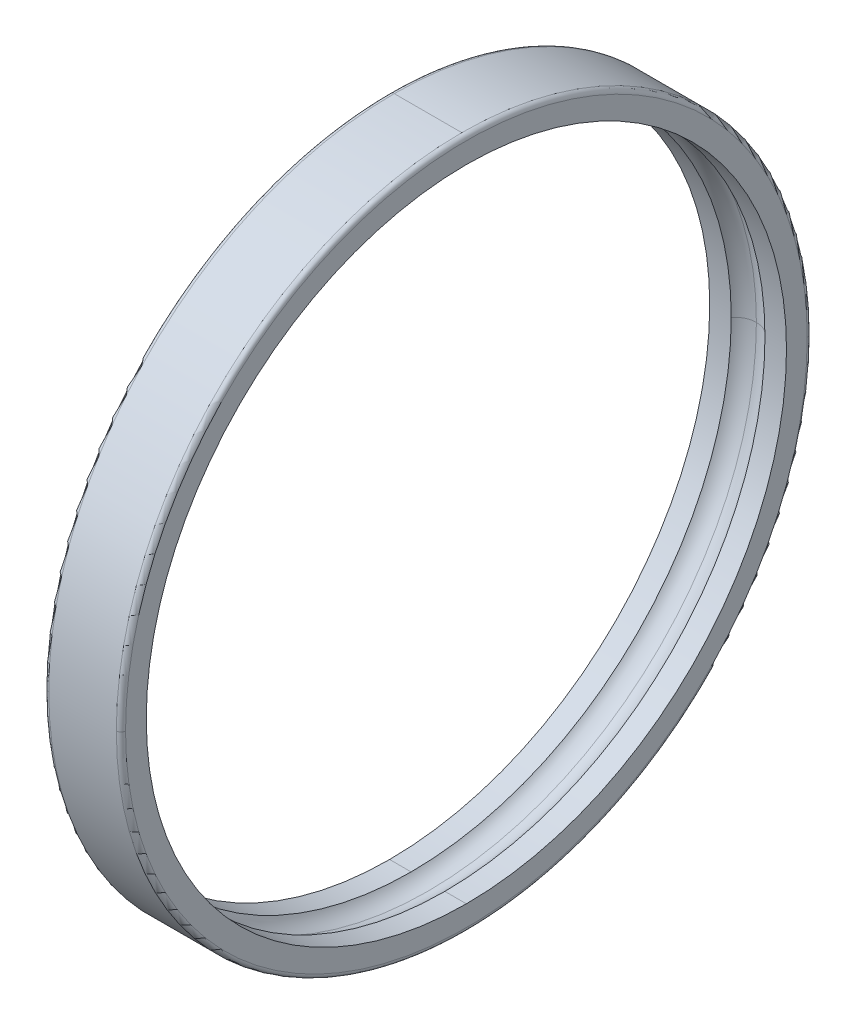
ISO-10303-21;
HEADER;
FILE_DESCRIPTION(('STEP AP214'),'2;1');
FILE_NAME('part.step','',(''),(''),'','','');
FILE_SCHEMA(('AUTOMOTIVE_DESIGN { 1 0 10303 214 1 1 1 1 }'));
ENDSEC;
DATA;
#1=APPLICATION_CONTEXT('core data for automotive mechanical design processes');
#2=APPLICATION_PROTOCOL_DEFINITION('international standard','automotive_design',2000,#1);
#3=PRODUCT_CONTEXT('',#1,'mechanical');
#4=PRODUCT('Part','Part','',(#3));
#5=PRODUCT_RELATED_PRODUCT_CATEGORY('part','',(#4));
#6=PRODUCT_DEFINITION_FORMATION('','',#4);
#7=PRODUCT_DEFINITION_CONTEXT('part definition',#1,'design');
#8=PRODUCT_DEFINITION('design','',#6,#7);
#9=PRODUCT_DEFINITION_SHAPE('','',#8);
#10=(LENGTH_UNIT() NAMED_UNIT(*) SI_UNIT(.MILLI.,.METRE.));
#11=(NAMED_UNIT(*) PLANE_ANGLE_UNIT() SI_UNIT($,.RADIAN.));
#12=(NAMED_UNIT(*) SI_UNIT($,.STERADIAN.) SOLID_ANGLE_UNIT());
#13=UNCERTAINTY_MEASURE_WITH_UNIT(LENGTH_MEASURE(1.E-05),#10,'distance_accuracy_value','');
#14=(GEOMETRIC_REPRESENTATION_CONTEXT(3) GLOBAL_UNCERTAINTY_ASSIGNED_CONTEXT((#13)) GLOBAL_UNIT_ASSIGNED_CONTEXT((#10,
#11,#12)) REPRESENTATION_CONTEXT('',''));
#15=CARTESIAN_POINT('',(0.,0.,0.));
#16=DIRECTION('',(0.,0.,1.));
#17=DIRECTION('',(1.,0.,0.));
#18=AXIS2_PLACEMENT_3D('',#15,#16,#17);
#19=CARTESIAN_POINT('',(8.59855404964889,0.,0.));
#20=DIRECTION('',(1.,0.,0.));
#21=DIRECTION('',(0.,1.,0.));
#22=AXIS2_PLACEMENT_3D('',#19,#20,#21);
#23=CYLINDRICAL_SURFACE('',#22,41.7);
#24=DIRECTION('',(1.,0.,0.));
#25=VECTOR('',#24,1.);
#26=CARTESIAN_POINT('',(8.59855404964889,41.7,0.));
#27=LINE('',#26,#25);
#28=CARTESIAN_POINT('',(7.19710809929778,41.7,0.));
#29=VERTEX_POINT('',#28);
#30=CARTESIAN_POINT('',(10.,41.7,0.));
#31=VERTEX_POINT('',#30);
#32=EDGE_CURVE('E175',#29,#31,#27,.T.);
#33=ORIENTED_EDGE('',*,*,#32,.T.);
#34=CARTESIAN_POINT('',(10.,0.,0.));
#35=DIRECTION('',(1.,0.,0.));
#36=DIRECTION('',(0.,1.,0.));
#37=AXIS2_PLACEMENT_3D('',#34,#35,#36);
#38=CIRCLE('',#37,41.7);
#39=CARTESIAN_POINT('',(10.,-41.7,0.));
#40=VERTEX_POINT('',#39);
#41=EDGE_CURVE('E10',#31,#40,#38,.T.);
#42=ORIENTED_EDGE('',*,*,#41,.T.);
#43=DIRECTION('',(-1.,0.,0.));
#44=VECTOR('',#43,1.);
#45=CARTESIAN_POINT('',(8.59855404964889,-41.7,0.));
#46=LINE('',#45,#44);
#47=CARTESIAN_POINT('',(7.19710809929778,-41.7,0.));
#48=VERTEX_POINT('',#47);
#49=EDGE_CURVE('E143',#40,#48,#46,.T.);
#50=ORIENTED_EDGE('',*,*,#49,.T.);
#51=CARTESIAN_POINT('',(7.19710809929778,0.,0.));
#52=DIRECTION('',(1.,0.,0.));
#53=DIRECTION('',(0.,1.,0.));
#54=AXIS2_PLACEMENT_3D('',#51,#52,#53);
#55=CIRCLE('',#54,41.7);
#56=CARTESIAN_POINT('',(7.19710809929778,0.,41.7));
#57=VERTEX_POINT('',#56);
#58=EDGE_CURVE('E181',#57,#48,#55,.T.);
#59=ORIENTED_EDGE('',*,*,#58,.F.);
#60=CARTESIAN_POINT('',(7.19710809929778,0.,0.));
#61=DIRECTION('',(1.,0.,0.));
#62=DIRECTION('',(0.,1.,0.));
#63=AXIS2_PLACEMENT_3D('',#60,#61,#62);
#64=CIRCLE('',#63,41.7);
#65=EDGE_CURVE('E187',#29,#57,#64,.T.);
#66=ORIENTED_EDGE('',*,*,#65,.F.);
#67=EDGE_LOOP('',(#33,#42,#50,#59,#66));
#68=FACE_BOUND('',#67,.T.);
#69=ADVANCED_FACE('F15',(#68),#23,.F.);
#70=CARTESIAN_POINT('',(10.,43.05,0.));
#71=DIRECTION('',(1.,0.,0.));
#72=DIRECTION('',(0.,1.,0.));
#73=AXIS2_PLACEMENT_3D('',#70,#71,#72);
#74=PLANE('',#73);
#75=ORIENTED_EDGE('',*,*,#41,.F.);
#76=CARTESIAN_POINT('',(10.,0.,0.));
#77=DIRECTION('',(1.,0.,0.));
#78=DIRECTION('',(0.,1.,0.));
#79=AXIS2_PLACEMENT_3D('',#76,#77,#78);
#80=CIRCLE('',#79,41.7);
#81=EDGE_CURVE('E138',#40,#31,#80,.T.);
#82=ORIENTED_EDGE('',*,*,#81,.F.);
#83=EDGE_LOOP('',(#75,#82));
#84=FACE_BOUND('',#83,.T.);
#85=CARTESIAN_POINT('',(10.,0.,0.));
#86=DIRECTION('',(1.,0.,0.));
#87=DIRECTION('',(0.,1.,0.));
#88=AXIS2_PLACEMENT_3D('',#85,#86,#87);
#89=CIRCLE('',#88,44.4);
#90=CARTESIAN_POINT('',(10.,0.,44.4));
#91=VERTEX_POINT('',#90);
#92=CARTESIAN_POINT('',(10.,0.,-44.4));
#93=VERTEX_POINT('',#92);
#94=EDGE_CURVE('E24',#91,#93,#89,.T.);
#95=ORIENTED_EDGE('',*,*,#94,.T.);
#96=CARTESIAN_POINT('',(10.,0.,0.));
#97=DIRECTION('',(1.,0.,0.));
#98=DIRECTION('',(0.,1.,0.));
#99=AXIS2_PLACEMENT_3D('',#96,#97,#98);
#100=CIRCLE('',#99,44.4);
#101=EDGE_CURVE('E119',#93,#91,#100,.T.);
#102=ORIENTED_EDGE('',*,*,#101,.T.);
#103=EDGE_LOOP('',(#95,#102));
#104=FACE_BOUND('',#103,.T.);
#105=ADVANCED_FACE('F17',(#84,#104),#74,.T.);
#106=CARTESIAN_POINT('',(9.4,0.,0.));
#107=DIRECTION('',(1.,0.,0.));
#108=DIRECTION('',(0.,0.,-1.));
#109=AXIS2_PLACEMENT_3D('',#106,#107,#108);
#110=TOROIDAL_SURFACE('',#109,44.4,0.6);
#111=CARTESIAN_POINT('',(9.4,0.,-44.4));
#112=DIRECTION('',(0.,-1.,0.));
#113=DIRECTION('',(0.,0.,-1.));
#114=AXIS2_PLACEMENT_3D('',#111,#112,#113);
#115=CIRCLE('',#114,0.6);
#116=CARTESIAN_POINT('',(9.4,0.,-45.));
#117=VERTEX_POINT('',#116);
#118=EDGE_CURVE('E129',#117,#93,#115,.T.);
#119=ORIENTED_EDGE('',*,*,#118,.T.);
#120=ORIENTED_EDGE('',*,*,#94,.F.);
#121=CARTESIAN_POINT('',(9.4,0.,44.4));
#122=DIRECTION('',(0.,-1.,0.));
#123=DIRECTION('',(0.,0.,1.));
#124=AXIS2_PLACEMENT_3D('',#121,#122,#123);
#125=CIRCLE('',#124,0.6);
#126=CARTESIAN_POINT('',(9.4,0.,45.));
#127=VERTEX_POINT('',#126);
#128=EDGE_CURVE('E131',#91,#127,#125,.T.);
#129=ORIENTED_EDGE('',*,*,#128,.T.);
#130=CARTESIAN_POINT('',(9.4,0.,0.));
#131=DIRECTION('',(1.,0.,0.));
#132=DIRECTION('',(0.,1.,0.));
#133=AXIS2_PLACEMENT_3D('',#130,#131,#132);
#134=CIRCLE('',#133,45.);
#135=CARTESIAN_POINT('',(9.4,-45.,0.));
#136=VERTEX_POINT('',#135);
#137=EDGE_CURVE('E163',#127,#136,#134,.T.);
#138=ORIENTED_EDGE('',*,*,#137,.T.);
#139=CARTESIAN_POINT('',(9.4,0.,0.));
#140=DIRECTION('',(1.,0.,0.));
#141=DIRECTION('',(0.,1.,0.));
#142=AXIS2_PLACEMENT_3D('',#139,#140,#141);
#143=CIRCLE('',#142,45.);
#144=EDGE_CURVE('E114',#136,#117,#143,.T.);
#145=ORIENTED_EDGE('',*,*,#144,.T.);
#146=EDGE_LOOP('',(#119,#120,#129,#138,#145));
#147=FACE_BOUND('',#146,.T.);
#148=ADVANCED_FACE('F134',(#147),#110,.T.);
#149=CARTESIAN_POINT('',(5.,0.,0.));
#150=DIRECTION('',(1.,0.,0.));
#151=DIRECTION('',(0.,1.,0.));
#152=AXIS2_PLACEMENT_3D('',#149,#150,#151);
#153=CYLINDRICAL_SURFACE('',#152,45.);
#154=DIRECTION('',(1.,0.,0.));
#155=VECTOR('',#154,1.);
#156=CARTESIAN_POINT('',(5.,45.,0.));
#157=LINE('',#156,#155);
#158=CARTESIAN_POINT('',(0.6,45.,0.));
#159=VERTEX_POINT('',#158);
#160=CARTESIAN_POINT('',(9.4,45.,0.));
#161=VERTEX_POINT('',#160);
#162=EDGE_CURVE('E132',#159,#161,#157,.T.);
#163=ORIENTED_EDGE('',*,*,#162,.T.);
#164=CARTESIAN_POINT('',(9.4,0.,0.));
#165=DIRECTION('',(1.,0.,0.));
#166=DIRECTION('',(0.,1.,0.));
#167=AXIS2_PLACEMENT_3D('',#164,#165,#166);
#168=CIRCLE('',#167,45.);
#169=EDGE_CURVE('E137',#117,#161,#168,.T.);
#170=ORIENTED_EDGE('',*,*,#169,.F.);
#171=ORIENTED_EDGE('',*,*,#144,.F.);
#172=DIRECTION('',(-1.,0.,0.));
#173=VECTOR('',#172,1.);
#174=CARTESIAN_POINT('',(5.,-45.,0.));
#175=LINE('',#174,#173);
#176=CARTESIAN_POINT('',(0.6,-45.,0.));
#177=VERTEX_POINT('',#176);
#178=EDGE_CURVE('E156',#136,#177,#175,.T.);
#179=ORIENTED_EDGE('',*,*,#178,.T.);
#180=CARTESIAN_POINT('',(0.6,0.,0.));
#181=DIRECTION('',(1.,0.,0.));
#182=DIRECTION('',(0.,1.,0.));
#183=AXIS2_PLACEMENT_3D('',#180,#181,#182);
#184=CIRCLE('',#183,45.);
#185=CARTESIAN_POINT('',(0.6,0.,-45.));
#186=VERTEX_POINT('',#185);
#187=EDGE_CURVE('E112',#177,#186,#184,.T.);
#188=ORIENTED_EDGE('',*,*,#187,.T.);
#189=CARTESIAN_POINT('',(0.6,0.,0.));
#190=DIRECTION('',(1.,0.,0.));
#191=DIRECTION('',(0.,1.,0.));
#192=AXIS2_PLACEMENT_3D('',#189,#190,#191);
#193=CIRCLE('',#192,45.);
#194=EDGE_CURVE('E157',#186,#159,#193,.T.);
#195=ORIENTED_EDGE('',*,*,#194,.T.);
#196=EDGE_LOOP('',(#163,#170,#171,#179,#188,#195));
#197=FACE_BOUND('',#196,.T.);
#198=ADVANCED_FACE('F258',(#197),#153,.T.);
#199=CARTESIAN_POINT('',(0.6,0.,0.));
#200=DIRECTION('',(1.,0.,0.));
#201=DIRECTION('',(0.,0.,-1.));
#202=AXIS2_PLACEMENT_3D('',#199,#200,#201);
#203=TOROIDAL_SURFACE('',#202,44.4,0.6);
#204=CARTESIAN_POINT('',(0.6,0.,-44.4));
#205=DIRECTION('',(0.,-1.,0.));
#206=DIRECTION('',(0.,0.,-1.));
#207=AXIS2_PLACEMENT_3D('',#204,#205,#206);
#208=CIRCLE('',#207,0.6);
#209=CARTESIAN_POINT('',(0.,0.,-44.4));
#210=VERTEX_POINT('',#209);
#211=EDGE_CURVE('E165',#210,#186,#208,.T.);
#212=ORIENTED_EDGE('',*,*,#211,.T.);
#213=ORIENTED_EDGE('',*,*,#187,.F.);
#214=CARTESIAN_POINT('',(0.6,0.,0.));
#215=DIRECTION('',(1.,0.,0.));
#216=DIRECTION('',(0.,1.,0.));
#217=AXIS2_PLACEMENT_3D('',#214,#215,#216);
#218=CIRCLE('',#217,45.);
#219=CARTESIAN_POINT('',(0.6,0.,45.));
#220=VERTEX_POINT('',#219);
#221=EDGE_CURVE('E153',#220,#177,#218,.T.);
#222=ORIENTED_EDGE('',*,*,#221,.F.);
#223=CARTESIAN_POINT('',(0.6,0.,44.4));
#224=DIRECTION('',(0.,-1.,0.));
#225=DIRECTION('',(0.,0.,1.));
#226=AXIS2_PLACEMENT_3D('',#223,#224,#225);
#227=CIRCLE('',#226,0.6);
#228=CARTESIAN_POINT('',(0.,0.,44.4));
#229=VERTEX_POINT('',#228);
#230=EDGE_CURVE('E160',#220,#229,#227,.T.);
#231=ORIENTED_EDGE('',*,*,#230,.T.);
#232=CARTESIAN_POINT('',(0.,0.,0.));
#233=DIRECTION('',(1.,0.,0.));
#234=DIRECTION('',(0.,1.,0.));
#235=AXIS2_PLACEMENT_3D('',#232,#233,#234);
#236=CIRCLE('',#235,44.4);
#237=EDGE_CURVE('E110',#229,#210,#236,.T.);
#238=ORIENTED_EDGE('',*,*,#237,.T.);
#239=EDGE_LOOP('',(#212,#213,#222,#231,#238));
#240=FACE_BOUND('',#239,.T.);
#241=ADVANCED_FACE('F261',(#240),#203,.T.);
#242=CARTESIAN_POINT('',(0.,43.05,0.));
#243=DIRECTION('',(-1.,0.,0.));
#244=DIRECTION('',(0.,1.,0.));
#245=AXIS2_PLACEMENT_3D('',#242,#243,#244);
#246=PLANE('',#245);
#247=CARTESIAN_POINT('',(0.,0.,0.));
#248=DIRECTION('',(1.,0.,0.));
#249=DIRECTION('',(0.,1.,0.));
#250=AXIS2_PLACEMENT_3D('',#247,#248,#249);
#251=CIRCLE('',#250,41.7);
#252=CARTESIAN_POINT('',(0.,41.7,0.));
#253=VERTEX_POINT('',#252);
#254=CARTESIAN_POINT('',(0.,-41.7,0.));
#255=VERTEX_POINT('',#254);
#256=EDGE_CURVE('E108',#253,#255,#251,.T.);
#257=ORIENTED_EDGE('',*,*,#256,.T.);
#258=CARTESIAN_POINT('',(0.,0.,0.));
#259=DIRECTION('',(1.,0.,0.));
#260=DIRECTION('',(0.,1.,0.));
#261=AXIS2_PLACEMENT_3D('',#258,#259,#260);
#262=CIRCLE('',#261,41.7);
#263=EDGE_CURVE('E99',#255,#253,#262,.T.);
#264=ORIENTED_EDGE('',*,*,#263,.T.);
#265=EDGE_LOOP('',(#257,#264));
#266=FACE_BOUND('',#265,.T.);
#267=CARTESIAN_POINT('',(0.,0.,0.));
#268=DIRECTION('',(1.,0.,0.));
#269=DIRECTION('',(0.,1.,0.));
#270=AXIS2_PLACEMENT_3D('',#267,#268,#269);
#271=CIRCLE('',#270,44.4);
#272=EDGE_CURVE('E166',#210,#229,#271,.T.);
#273=ORIENTED_EDGE('',*,*,#272,.F.);
#274=ORIENTED_EDGE('',*,*,#237,.F.);
#275=EDGE_LOOP('',(#273,#274));
#276=FACE_BOUND('',#275,.T.);
#277=ADVANCED_FACE('F265',(#266,#276),#246,.T.);
#278=CARTESIAN_POINT('',(1.4014459503511,0.,0.));
#279=DIRECTION('',(1.,0.,0.));
#280=DIRECTION('',(0.,1.,0.));
#281=AXIS2_PLACEMENT_3D('',#278,#279,#280);
#282=CYLINDRICAL_SURFACE('',#281,41.7);
#283=DIRECTION('',(1.,0.,0.));
#284=VECTOR('',#283,1.);
#285=CARTESIAN_POINT('',(1.4014459503511,41.7,0.));
#286=LINE('',#285,#284);
#287=CARTESIAN_POINT('',(2.8028919007022,41.7,0.));
#288=VERTEX_POINT('',#287);
#289=EDGE_CURVE('E101',#253,#288,#286,.T.);
#290=ORIENTED_EDGE('',*,*,#289,.T.);
#291=CARTESIAN_POINT('',(2.8028919007022,0.,0.));
#292=DIRECTION('',(1.,0.,0.));
#293=DIRECTION('',(0.,1.,0.));
#294=AXIS2_PLACEMENT_3D('',#291,#292,#293);
#295=CIRCLE('',#294,41.7);
#296=CARTESIAN_POINT('',(2.8028919007022,0.,41.7));
#297=VERTEX_POINT('',#296);
#298=EDGE_CURVE('E31',#288,#297,#295,.T.);
#299=ORIENTED_EDGE('',*,*,#298,.T.);
#300=CARTESIAN_POINT('',(2.8028919007022,0.,0.));
#301=DIRECTION('',(1.,0.,0.));
#302=DIRECTION('',(0.,1.,0.));
#303=AXIS2_PLACEMENT_3D('',#300,#301,#302);
#304=CIRCLE('',#303,41.7);
#305=CARTESIAN_POINT('',(2.8028919007022,-41.7,0.));
#306=VERTEX_POINT('',#305);
#307=EDGE_CURVE('E75',#297,#306,#304,.T.);
#308=ORIENTED_EDGE('',*,*,#307,.T.);
#309=DIRECTION('',(-1.,0.,0.));
#310=VECTOR('',#309,1.);
#311=CARTESIAN_POINT('',(1.4014459503511,-41.7,0.));
#312=LINE('',#311,#310);
#313=EDGE_CURVE('E79',#306,#255,#312,.T.);
#314=ORIENTED_EDGE('',*,*,#313,.T.);
#315=ORIENTED_EDGE('',*,*,#256,.F.);
#316=EDGE_LOOP('',(#290,#299,#308,#314,#315));
#317=FACE_BOUND('',#316,.T.);
#318=ADVANCED_FACE('F77',(#317),#282,.F.);
#319=CARTESIAN_POINT('',(5.,0.,0.));
#320=DIRECTION('',(1.,0.,0.));
#321=DIRECTION('',(0.,0.,-1.));
#322=AXIS2_PLACEMENT_3D('',#319,#320,#321);
#323=TOROIDAL_SURFACE('',#322,40.,2.778);
#324=CARTESIAN_POINT('',(5.,0.,0.));
#325=DIRECTION('',(1.,0.,0.));
#326=DIRECTION('',(0.,0.,1.));
#327=AXIS2_PLACEMENT_3D('',#324,#325,#326);
#328=CIRCLE('',#327,42.778);
#329=CARTESIAN_POINT('',(5.,0.,-42.778));
#330=VERTEX_POINT('',#329);
#331=CARTESIAN_POINT('',(5.,0.,42.778));
#332=VERTEX_POINT('',#331);
#333=EDGE_CURVE('E202',#330,#332,#328,.T.);
#334=ORIENTED_EDGE('',*,*,#333,.T.);
#335=CARTESIAN_POINT('',(5.,0.,40.));
#336=DIRECTION('',(0.,-1.,0.));
#337=DIRECTION('',(0.,0.,1.));
#338=AXIS2_PLACEMENT_3D('',#335,#336,#337);
#339=CIRCLE('',#338,2.778);
#340=EDGE_CURVE('E83',#332,#297,#339,.T.);
#341=ORIENTED_EDGE('',*,*,#340,.T.);
#342=ORIENTED_EDGE('',*,*,#298,.F.);
#343=CARTESIAN_POINT('',(2.8028919007022,0.,0.));
#344=DIRECTION('',(1.,0.,0.));
#345=DIRECTION('',(0.,1.,0.));
#346=AXIS2_PLACEMENT_3D('',#343,#344,#345);
#347=CIRCLE('',#346,41.7);
#348=CARTESIAN_POINT('',(2.8028919007022,0.,-41.7));
#349=VERTEX_POINT('',#348);
#350=EDGE_CURVE('E94',#349,#288,#347,.T.);
#351=ORIENTED_EDGE('',*,*,#350,.F.);
#352=CARTESIAN_POINT('',(5.,0.,-40.));
#353=DIRECTION('',(0.,-1.,0.));
#354=DIRECTION('',(0.,0.,-1.));
#355=AXIS2_PLACEMENT_3D('',#352,#353,#354);
#356=CIRCLE('',#355,2.778);
#357=EDGE_CURVE('E84',#349,#330,#356,.T.);
#358=ORIENTED_EDGE('',*,*,#357,.T.);
#359=EDGE_LOOP('',(#334,#341,#342,#351,#358));
#360=FACE_BOUND('',#359,.T.);
#361=ADVANCED_FACE('F172',(#360),#323,.F.);
#362=CARTESIAN_POINT('',(5.,0.,0.));
#363=DIRECTION('',(1.,0.,0.));
#364=DIRECTION('',(0.,0.,-1.));
#365=AXIS2_PLACEMENT_3D('',#362,#363,#364);
#366=TOROIDAL_SURFACE('',#365,40.,2.778);
#367=CARTESIAN_POINT('',(5.,0.,0.));
#368=DIRECTION('',(1.,0.,0.));
#369=DIRECTION('',(0.,0.,1.));
#370=AXIS2_PLACEMENT_3D('',#367,#368,#369);
#371=CIRCLE('',#370,42.778);
#372=EDGE_CURVE('E179',#332,#330,#371,.T.);
#373=ORIENTED_EDGE('',*,*,#372,.T.);
#374=ORIENTED_EDGE('',*,*,#357,.F.);
#375=CARTESIAN_POINT('',(2.8028919007022,0.,0.));
#376=DIRECTION('',(1.,0.,0.));
#377=DIRECTION('',(0.,1.,0.));
#378=AXIS2_PLACEMENT_3D('',#375,#376,#377);
#379=CIRCLE('',#378,41.7);
#380=EDGE_CURVE('E87',#306,#349,#379,.T.);
#381=ORIENTED_EDGE('',*,*,#380,.F.);
#382=ORIENTED_EDGE('',*,*,#307,.F.);
#383=ORIENTED_EDGE('',*,*,#340,.F.);
#384=EDGE_LOOP('',(#373,#374,#381,#382,#383));
#385=FACE_BOUND('',#384,.T.);
#386=ADVANCED_FACE('F89',(#385),#366,.F.);
#387=CARTESIAN_POINT('',(1.4014459503511,0.,0.));
#388=DIRECTION('',(1.,0.,0.));
#389=DIRECTION('',(0.,1.,0.));
#390=AXIS2_PLACEMENT_3D('',#387,#388,#389);
#391=CYLINDRICAL_SURFACE('',#390,41.7);
#392=ORIENTED_EDGE('',*,*,#289,.F.);
#393=ORIENTED_EDGE('',*,*,#263,.F.);
#394=ORIENTED_EDGE('',*,*,#313,.F.);
#395=ORIENTED_EDGE('',*,*,#380,.T.);
#396=ORIENTED_EDGE('',*,*,#350,.T.);
#397=EDGE_LOOP('',(#392,#393,#394,#395,#396));
#398=FACE_BOUND('',#397,.T.);
#399=ADVANCED_FACE('F97',(#398),#391,.F.);
#400=CARTESIAN_POINT('',(0.6,0.,0.));
#401=DIRECTION('',(1.,0.,0.));
#402=DIRECTION('',(0.,0.,-1.));
#403=AXIS2_PLACEMENT_3D('',#400,#401,#402);
#404=TOROIDAL_SURFACE('',#403,44.4,0.6);
#405=ORIENTED_EDGE('',*,*,#211,.F.);
#406=ORIENTED_EDGE('',*,*,#272,.T.);
#407=ORIENTED_EDGE('',*,*,#230,.F.);
#408=CARTESIAN_POINT('',(0.6,0.,0.));
#409=DIRECTION('',(1.,0.,0.));
#410=DIRECTION('',(0.,1.,0.));
#411=AXIS2_PLACEMENT_3D('',#408,#409,#410);
#412=CIRCLE('',#411,45.);
#413=EDGE_CURVE('E150',#159,#220,#412,.T.);
#414=ORIENTED_EDGE('',*,*,#413,.F.);
#415=ORIENTED_EDGE('',*,*,#194,.F.);
#416=EDGE_LOOP('',(#405,#406,#407,#414,#415));
#417=FACE_BOUND('',#416,.T.);
#418=ADVANCED_FACE('F279',(#417),#404,.T.);
#419=CARTESIAN_POINT('',(5.,0.,0.));
#420=DIRECTION('',(1.,0.,0.));
#421=DIRECTION('',(0.,1.,0.));
#422=AXIS2_PLACEMENT_3D('',#419,#420,#421);
#423=CYLINDRICAL_SURFACE('',#422,45.);
#424=ORIENTED_EDGE('',*,*,#162,.F.);
#425=ORIENTED_EDGE('',*,*,#413,.T.);
#426=ORIENTED_EDGE('',*,*,#221,.T.);
#427=ORIENTED_EDGE('',*,*,#178,.F.);
#428=ORIENTED_EDGE('',*,*,#137,.F.);
#429=CARTESIAN_POINT('',(9.4,0.,0.));
#430=DIRECTION('',(1.,0.,0.));
#431=DIRECTION('',(0.,1.,0.));
#432=AXIS2_PLACEMENT_3D('',#429,#430,#431);
#433=CIRCLE('',#432,45.);
#434=EDGE_CURVE('E140',#161,#127,#433,.T.);
#435=ORIENTED_EDGE('',*,*,#434,.F.);
#436=EDGE_LOOP('',(#424,#425,#426,#427,#428,#435));
#437=FACE_BOUND('',#436,.T.);
#438=ADVANCED_FACE('F285',(#437),#423,.T.);
#439=CARTESIAN_POINT('',(9.4,0.,0.));
#440=DIRECTION('',(1.,0.,0.));
#441=DIRECTION('',(0.,0.,-1.));
#442=AXIS2_PLACEMENT_3D('',#439,#440,#441);
#443=TOROIDAL_SURFACE('',#442,44.4,0.6);
#444=ORIENTED_EDGE('',*,*,#118,.F.);
#445=ORIENTED_EDGE('',*,*,#169,.T.);
#446=ORIENTED_EDGE('',*,*,#434,.T.);
#447=ORIENTED_EDGE('',*,*,#128,.F.);
#448=ORIENTED_EDGE('',*,*,#101,.F.);
#449=EDGE_LOOP('',(#444,#445,#446,#447,#448));
#450=FACE_BOUND('',#449,.T.);
#451=ADVANCED_FACE('F127',(#450),#443,.T.);
#452=CARTESIAN_POINT('',(8.59855404964889,0.,0.));
#453=DIRECTION('',(1.,0.,0.));
#454=DIRECTION('',(0.,1.,0.));
#455=AXIS2_PLACEMENT_3D('',#452,#453,#454);
#456=CYLINDRICAL_SURFACE('',#455,41.7);
#457=ORIENTED_EDGE('',*,*,#32,.F.);
#458=CARTESIAN_POINT('',(7.19710809929778,0.,0.));
#459=DIRECTION('',(1.,0.,0.));
#460=DIRECTION('',(0.,1.,0.));
#461=AXIS2_PLACEMENT_3D('',#458,#459,#460);
#462=CIRCLE('',#461,41.7);
#463=CARTESIAN_POINT('',(7.19710809929778,0.,-41.7));
#464=VERTEX_POINT('',#463);
#465=EDGE_CURVE('E190',#464,#29,#462,.T.);
#466=ORIENTED_EDGE('',*,*,#465,.F.);
#467=CARTESIAN_POINT('',(7.19710809929778,0.,0.));
#468=DIRECTION('',(1.,0.,0.));
#469=DIRECTION('',(0.,1.,0.));
#470=AXIS2_PLACEMENT_3D('',#467,#468,#469);
#471=CIRCLE('',#470,41.7);
#472=EDGE_CURVE('E178',#48,#464,#471,.T.);
#473=ORIENTED_EDGE('',*,*,#472,.F.);
#474=ORIENTED_EDGE('',*,*,#49,.F.);
#475=ORIENTED_EDGE('',*,*,#81,.T.);
#476=EDGE_LOOP('',(#457,#466,#473,#474,#475));
#477=FACE_BOUND('',#476,.T.);
#478=ADVANCED_FACE('F236',(#477),#456,.F.);
#479=CARTESIAN_POINT('',(5.,0.,0.));
#480=DIRECTION('',(1.,0.,0.));
#481=DIRECTION('',(0.,0.,-1.));
#482=AXIS2_PLACEMENT_3D('',#479,#480,#481);
#483=TOROIDAL_SURFACE('',#482,40.,2.778);
#484=ORIENTED_EDGE('',*,*,#372,.F.);
#485=CARTESIAN_POINT('',(5.,0.,40.));
#486=DIRECTION('',(0.,-1.,0.));
#487=DIRECTION('',(0.,0.,1.));
#488=AXIS2_PLACEMENT_3D('',#485,#486,#487);
#489=CIRCLE('',#488,2.778);
#490=EDGE_CURVE('E182',#57,#332,#489,.T.);
#491=ORIENTED_EDGE('',*,*,#490,.F.);
#492=ORIENTED_EDGE('',*,*,#58,.T.);
#493=ORIENTED_EDGE('',*,*,#472,.T.);
#494=CARTESIAN_POINT('',(5.,0.,-40.));
#495=DIRECTION('',(0.,-1.,0.));
#496=DIRECTION('',(0.,0.,-1.));
#497=AXIS2_PLACEMENT_3D('',#494,#495,#496);
#498=CIRCLE('',#497,2.778);
#499=EDGE_CURVE('E197',#330,#464,#498,.T.);
#500=ORIENTED_EDGE('',*,*,#499,.F.);
#501=EDGE_LOOP('',(#484,#491,#492,#493,#500));
#502=FACE_BOUND('',#501,.T.);
#503=ADVANCED_FACE('F240',(#502),#483,.F.);
#504=CARTESIAN_POINT('',(5.,0.,0.));
#505=DIRECTION('',(1.,0.,0.));
#506=DIRECTION('',(0.,0.,-1.));
#507=AXIS2_PLACEMENT_3D('',#504,#505,#506);
#508=TOROIDAL_SURFACE('',#507,40.,2.778);
#509=ORIENTED_EDGE('',*,*,#333,.F.);
#510=ORIENTED_EDGE('',*,*,#499,.T.);
#511=ORIENTED_EDGE('',*,*,#465,.T.);
#512=ORIENTED_EDGE('',*,*,#65,.T.);
#513=ORIENTED_EDGE('',*,*,#490,.T.);
#514=EDGE_LOOP('',(#509,#510,#511,#512,#513));
#515=FACE_BOUND('',#514,.T.);
#516=ADVANCED_FACE('F208',(#515),#508,.F.);
#517=CLOSED_SHELL('',(#69,#105,#148,#198,#241,#277,#318,#361,#386,#399,#418,#438,#451,#478,#503,#516));
#518=MANIFOLD_SOLID_BREP('B1',#517);
#519=ADVANCED_BREP_SHAPE_REPRESENTATION('',(#18,#518),#14);
#520=SHAPE_DEFINITION_REPRESENTATION(#9,#519);
ENDSEC;
END-ISO-10303-21;
